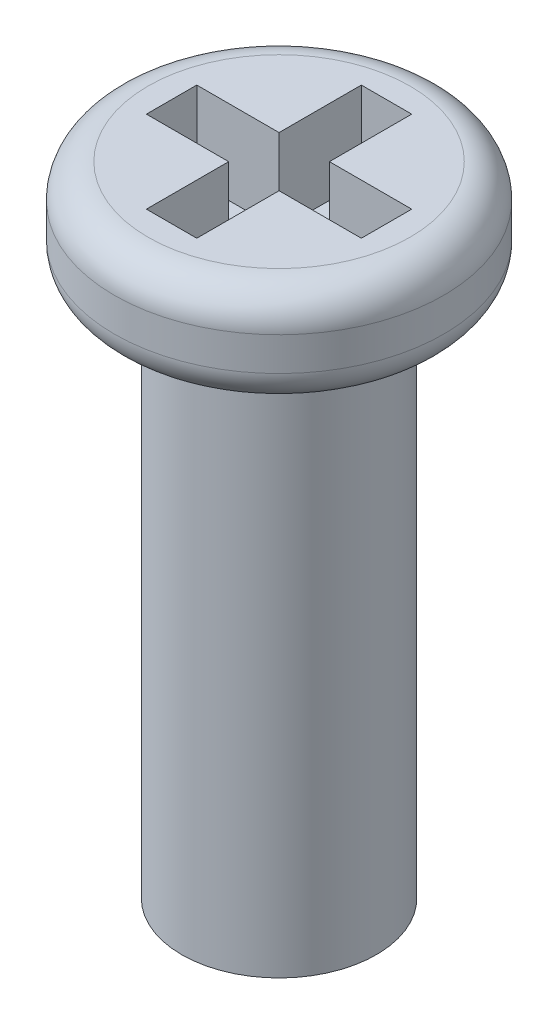
ISO-10303-21;
HEADER;
FILE_DESCRIPTION(('STEP AP214'),'2;1');
FILE_NAME('part.step','',(''),(''),'','','');
FILE_SCHEMA(('AUTOMOTIVE_DESIGN { 1 0 10303 214 1 1 1 1 }'));
ENDSEC;
DATA;
#1=APPLICATION_CONTEXT('core data for automotive mechanical design processes');
#2=APPLICATION_PROTOCOL_DEFINITION('international standard','automotive_design',2000,#1);
#3=PRODUCT_CONTEXT('',#1,'mechanical');
#4=PRODUCT('Part','Part','',(#3));
#5=PRODUCT_RELATED_PRODUCT_CATEGORY('part','',(#4));
#6=PRODUCT_DEFINITION_FORMATION('','',#4);
#7=PRODUCT_DEFINITION_CONTEXT('part definition',#1,'design');
#8=PRODUCT_DEFINITION('design','',#6,#7);
#9=PRODUCT_DEFINITION_SHAPE('','',#8);
#10=(LENGTH_UNIT() NAMED_UNIT(*) SI_UNIT(.MILLI.,.METRE.));
#11=(NAMED_UNIT(*) PLANE_ANGLE_UNIT() SI_UNIT($,.RADIAN.));
#12=(NAMED_UNIT(*) SI_UNIT($,.STERADIAN.) SOLID_ANGLE_UNIT());
#13=UNCERTAINTY_MEASURE_WITH_UNIT(LENGTH_MEASURE(1.E-05),#10,'distance_accuracy_value','');
#14=(GEOMETRIC_REPRESENTATION_CONTEXT(3) GLOBAL_UNCERTAINTY_ASSIGNED_CONTEXT((#13)) GLOBAL_UNIT_ASSIGNED_CONTEXT((#10,
#11,#12)) REPRESENTATION_CONTEXT('',''));
#15=CARTESIAN_POINT('',(0.,0.,0.));
#16=DIRECTION('',(0.,0.,1.));
#17=DIRECTION('',(1.,0.,0.));
#18=AXIS2_PLACEMENT_3D('',#15,#16,#17);
#19=CARTESIAN_POINT('',(0.,8.,0.));
#20=DIRECTION('',(0.,-1.,0.));
#21=DIRECTION('',(0.,0.,-1.));
#22=AXIS2_PLACEMENT_3D('',#19,#20,#21);
#23=CYLINDRICAL_SURFACE('',#22,1.45);
#24=CARTESIAN_POINT('',(0.,8.,0.));
#25=DIRECTION('',(0.,1.,0.));
#26=DIRECTION('',(0.,0.,1.));
#27=AXIS2_PLACEMENT_3D('',#24,#25,#26);
#28=CIRCLE('',#27,1.45);
#29=CARTESIAN_POINT('',(0.,8.,1.45));
#30=VERTEX_POINT('',#29);
#31=EDGE_CURVE('E178',#30,#30,#28,.T.);
#32=ORIENTED_EDGE('',*,*,#31,.F.);
#33=EDGE_LOOP('',(#32));
#34=FACE_BOUND('',#33,.T.);
#35=CARTESIAN_POINT('',(0.,0.,0.));
#36=DIRECTION('',(0.,1.,0.));
#37=DIRECTION('',(0.,0.,1.));
#38=AXIS2_PLACEMENT_3D('',#35,#36,#37);
#39=CIRCLE('',#38,1.45);
#40=CARTESIAN_POINT('',(0.,0.,1.45));
#41=VERTEX_POINT('',#40);
#42=EDGE_CURVE('E182',#41,#41,#39,.T.);
#43=ORIENTED_EDGE('',*,*,#42,.T.);
#44=EDGE_LOOP('',(#43));
#45=FACE_BOUND('',#44,.T.);
#46=ADVANCED_FACE('F32',(#34,#45),#23,.T.);
#47=CARTESIAN_POINT('',(0.,0.,0.));
#48=DIRECTION('',(0.,1.,0.));
#49=DIRECTION('',(0.,0.,1.));
#50=AXIS2_PLACEMENT_3D('',#47,#48,#49);
#51=PLANE('',#50);
#52=ORIENTED_EDGE('',*,*,#42,.F.);
#53=EDGE_LOOP('',(#52));
#54=FACE_BOUND('',#53,.T.);
#55=ADVANCED_FACE('F350',(#54),#51,.F.);
#56=CARTESIAN_POINT('',(0.,8.,0.));
#57=DIRECTION('',(0.,1.,0.));
#58=DIRECTION('',(0.,0.,1.));
#59=AXIS2_PLACEMENT_3D('',#56,#57,#58);
#60=PLANE('',#59);
#61=CARTESIAN_POINT('',(0.,8.,0.));
#62=DIRECTION('',(0.,1.,0.));
#63=DIRECTION('',(0.,0.,1.));
#64=AXIS2_PLACEMENT_3D('',#61,#62,#63);
#65=CIRCLE('',#64,1.95);
#66=CARTESIAN_POINT('',(0.,8.,1.95));
#67=VERTEX_POINT('',#66);
#68=EDGE_CURVE('E191',#67,#67,#65,.F.);
#69=ORIENTED_EDGE('',*,*,#68,.T.);
#70=EDGE_LOOP('',(#69));
#71=FACE_BOUND('',#70,.T.);
#72=ORIENTED_EDGE('',*,*,#31,.T.);
#73=EDGE_LOOP('',(#72));
#74=FACE_BOUND('',#73,.T.);
#75=ADVANCED_FACE('F356',(#71,#74),#60,.F.);
#76=CARTESIAN_POINT('',(0.,9.5,0.));
#77=DIRECTION('',(0.,-1.,0.));
#78=DIRECTION('',(0.,0.,-1.));
#79=AXIS2_PLACEMENT_3D('',#76,#77,#78);
#80=CYLINDRICAL_SURFACE('',#79,2.45);
#81=CARTESIAN_POINT('',(0.,8.5,0.));
#82=DIRECTION('',(0.,1.,0.));
#83=DIRECTION('',(0.,0.,1.));
#84=AXIS2_PLACEMENT_3D('',#81,#82,#83);
#85=CIRCLE('',#84,2.45);
#86=CARTESIAN_POINT('',(0.,8.5,2.45));
#87=VERTEX_POINT('',#86);
#88=EDGE_CURVE('E188',#87,#87,#85,.T.);
#89=ORIENTED_EDGE('',*,*,#88,.T.);
#90=EDGE_LOOP('',(#89));
#91=FACE_BOUND('',#90,.T.);
#92=CARTESIAN_POINT('',(0.,9.,0.));
#93=DIRECTION('',(0.,1.,0.));
#94=DIRECTION('',(0.,0.,1.));
#95=AXIS2_PLACEMENT_3D('',#92,#93,#94);
#96=CIRCLE('',#95,2.45);
#97=CARTESIAN_POINT('',(0.,9.,2.45));
#98=VERTEX_POINT('',#97);
#99=EDGE_CURVE('E181',#98,#98,#96,.F.);
#100=ORIENTED_EDGE('',*,*,#99,.T.);
#101=EDGE_LOOP('',(#100));
#102=FACE_BOUND('',#101,.T.);
#103=ADVANCED_FACE('F506',(#91,#102),#80,.T.);
#104=CARTESIAN_POINT('',(0.,9.5,0.));
#105=DIRECTION('',(0.,1.,0.));
#106=DIRECTION('',(0.,0.,1.));
#107=AXIS2_PLACEMENT_3D('',#104,#105,#106);
#108=PLANE('',#107);
#109=DIRECTION('',(0.,0.,1.));
#110=VECTOR('',#109,1.);
#111=CARTESIAN_POINT('',(-0.375,9.5,0.));
#112=LINE('',#111,#110);
#113=CARTESIAN_POINT('',(-0.375,9.5,-1.6));
#114=VERTEX_POINT('',#113);
#115=CARTESIAN_POINT('',(-0.375,9.5,-0.375));
#116=VERTEX_POINT('',#115);
#117=EDGE_CURVE('E168',#114,#116,#112,.T.);
#118=ORIENTED_EDGE('',*,*,#117,.F.);
#119=DIRECTION('',(1.,0.,0.));
#120=VECTOR('',#119,1.);
#121=CARTESIAN_POINT('',(0.,9.5,-1.6));
#122=LINE('',#121,#120);
#123=CARTESIAN_POINT('',(0.375,9.5,-1.6));
#124=VERTEX_POINT('',#123);
#125=EDGE_CURVE('E164',#114,#124,#122,.T.);
#126=ORIENTED_EDGE('',*,*,#125,.T.);
#127=DIRECTION('',(0.,0.,1.));
#128=VECTOR('',#127,1.);
#129=CARTESIAN_POINT('',(0.375,9.5,0.));
#130=LINE('',#129,#128);
#131=CARTESIAN_POINT('',(0.375,9.5,-0.375));
#132=VERTEX_POINT('',#131);
#133=EDGE_CURVE('E295',#124,#132,#130,.T.);
#134=ORIENTED_EDGE('',*,*,#133,.T.);
#135=DIRECTION('',(1.,0.,0.));
#136=VECTOR('',#135,1.);
#137=CARTESIAN_POINT('',(0.,9.5,-0.375));
#138=LINE('',#137,#136);
#139=CARTESIAN_POINT('',(1.6,9.5,-0.375));
#140=VERTEX_POINT('',#139);
#141=EDGE_CURVE('E293',#132,#140,#138,.T.);
#142=ORIENTED_EDGE('',*,*,#141,.T.);
#143=DIRECTION('',(0.,0.,1.));
#144=VECTOR('',#143,1.);
#145=CARTESIAN_POINT('',(1.6,9.5,0.));
#146=LINE('',#145,#144);
#147=CARTESIAN_POINT('',(1.6,9.5,0.375));
#148=VERTEX_POINT('',#147);
#149=EDGE_CURVE('E290',#140,#148,#146,.T.);
#150=ORIENTED_EDGE('',*,*,#149,.T.);
#151=DIRECTION('',(1.,0.,0.));
#152=VECTOR('',#151,1.);
#153=CARTESIAN_POINT('',(0.,9.5,0.375));
#154=LINE('',#153,#152);
#155=CARTESIAN_POINT('',(0.375,9.5,0.375));
#156=VERTEX_POINT('',#155);
#157=EDGE_CURVE('E287',#156,#148,#154,.T.);
#158=ORIENTED_EDGE('',*,*,#157,.F.);
#159=DIRECTION('',(0.,0.,1.));
#160=VECTOR('',#159,1.);
#161=CARTESIAN_POINT('',(0.375,9.5,0.));
#162=LINE('',#161,#160);
#163=CARTESIAN_POINT('',(0.375,9.5,1.6));
#164=VERTEX_POINT('',#163);
#165=EDGE_CURVE('E284',#156,#164,#162,.T.);
#166=ORIENTED_EDGE('',*,*,#165,.T.);
#167=DIRECTION('',(1.,0.,0.));
#168=VECTOR('',#167,1.);
#169=CARTESIAN_POINT('',(0.,9.5,1.6));
#170=LINE('',#169,#168);
#171=CARTESIAN_POINT('',(-0.375,9.5,1.6));
#172=VERTEX_POINT('',#171);
#173=EDGE_CURVE('E278',#172,#164,#170,.T.);
#174=ORIENTED_EDGE('',*,*,#173,.F.);
#175=DIRECTION('',(0.,0.,1.));
#176=VECTOR('',#175,1.);
#177=CARTESIAN_POINT('',(-0.375,9.5,0.));
#178=LINE('',#177,#176);
#179=CARTESIAN_POINT('',(-0.375,9.5,0.375));
#180=VERTEX_POINT('',#179);
#181=EDGE_CURVE('E276',#180,#172,#178,.T.);
#182=ORIENTED_EDGE('',*,*,#181,.F.);
#183=DIRECTION('',(1.,0.,0.));
#184=VECTOR('',#183,1.);
#185=CARTESIAN_POINT('',(0.,9.5,0.375));
#186=LINE('',#185,#184);
#187=CARTESIAN_POINT('',(-1.6,9.5,0.375));
#188=VERTEX_POINT('',#187);
#189=EDGE_CURVE('E262',#188,#180,#186,.T.);
#190=ORIENTED_EDGE('',*,*,#189,.F.);
#191=DIRECTION('',(0.,0.,1.));
#192=VECTOR('',#191,1.);
#193=CARTESIAN_POINT('',(-1.6,9.5,0.));
#194=LINE('',#193,#192);
#195=CARTESIAN_POINT('',(-1.6,9.5,-0.375));
#196=VERTEX_POINT('',#195);
#197=EDGE_CURVE('E267',#196,#188,#194,.T.);
#198=ORIENTED_EDGE('',*,*,#197,.F.);
#199=DIRECTION('',(1.,0.,0.));
#200=VECTOR('',#199,1.);
#201=CARTESIAN_POINT('',(0.,9.5,-0.375));
#202=LINE('',#201,#200);
#203=EDGE_CURVE('E270',#196,#116,#202,.T.);
#204=ORIENTED_EDGE('',*,*,#203,.T.);
#205=EDGE_LOOP('',(#118,#126,#134,#142,#150,#158,#166,#174,#182,#190,#198,#204));
#206=FACE_BOUND('',#205,.T.);
#207=CARTESIAN_POINT('',(0.,9.5,0.));
#208=DIRECTION('',(0.,1.,0.));
#209=DIRECTION('',(0.,0.,1.));
#210=AXIS2_PLACEMENT_3D('',#207,#208,#209);
#211=CIRCLE('',#210,1.95);
#212=CARTESIAN_POINT('',(0.,9.5,1.95));
#213=VERTEX_POINT('',#212);
#214=EDGE_CURVE('E194',#213,#213,#211,.T.);
#215=ORIENTED_EDGE('',*,*,#214,.T.);
#216=EDGE_LOOP('',(#215));
#217=FACE_BOUND('',#216,.T.);
#218=ADVANCED_FACE('F272',(#206,#217),#108,.T.);
#219=CARTESIAN_POINT('',(0.,8.5,0.));
#220=DIRECTION('',(0.,1.,0.));
#221=DIRECTION('',(0.,0.,1.));
#222=AXIS2_PLACEMENT_3D('',#219,#220,#221);
#223=TOROIDAL_SURFACE('',#222,1.95,0.5);
#224=ORIENTED_EDGE('',*,*,#68,.F.);
#225=EDGE_LOOP('',(#224));
#226=FACE_BOUND('',#225,.T.);
#227=ORIENTED_EDGE('',*,*,#88,.F.);
#228=EDGE_LOOP('',(#227));
#229=FACE_BOUND('',#228,.T.);
#230=ADVANCED_FACE('F363',(#226,#229),#223,.T.);
#231=CARTESIAN_POINT('',(0.,9.,0.));
#232=DIRECTION('',(0.,1.,0.));
#233=DIRECTION('',(0.,0.,1.));
#234=AXIS2_PLACEMENT_3D('',#231,#232,#233);
#235=TOROIDAL_SURFACE('',#234,1.95,0.5);
#236=ORIENTED_EDGE('',*,*,#99,.F.);
#237=EDGE_LOOP('',(#236));
#238=FACE_BOUND('',#237,.T.);
#239=ORIENTED_EDGE('',*,*,#214,.F.);
#240=EDGE_LOOP('',(#239));
#241=FACE_BOUND('',#240,.T.);
#242=ADVANCED_FACE('F366',(#238,#241),#235,.T.);
#243=CARTESIAN_POINT('',(-0.375,8.25,0.));
#244=DIRECTION('',(-1.,0.,0.));
#245=DIRECTION('',(0.,0.,1.));
#246=AXIS2_PLACEMENT_3D('',#243,#244,#245);
#247=PLANE('',#246);
#248=DIRECTION('',(0.,0.,1.));
#249=VECTOR('',#248,1.);
#250=CARTESIAN_POINT('',(-0.375,8.25,0.));
#251=LINE('',#250,#249);
#252=CARTESIAN_POINT('',(-0.375,8.25,-1.1));
#253=VERTEX_POINT('',#252);
#254=CARTESIAN_POINT('',(-0.375,8.25,-0.375));
#255=VERTEX_POINT('',#254);
#256=EDGE_CURVE('E158',#253,#255,#251,.T.);
#257=ORIENTED_EDGE('',*,*,#256,.F.);
#258=CARTESIAN_POINT('',(-0.375,8.75,-1.1));
#259=DIRECTION('',(-1.,0.,0.));
#260=DIRECTION('',(0.,0.,1.));
#261=AXIS2_PLACEMENT_3D('',#258,#259,#260);
#262=CIRCLE('',#261,0.5);
#263=CARTESIAN_POINT('',(-0.375,8.75,-1.6));
#264=VERTEX_POINT('',#263);
#265=EDGE_CURVE('E11',#253,#264,#262,.F.);
#266=ORIENTED_EDGE('',*,*,#265,.T.);
#267=DIRECTION('',(0.,1.,0.));
#268=VECTOR('',#267,1.);
#269=CARTESIAN_POINT('',(-0.375,8.25,-1.6));
#270=LINE('',#269,#268);
#271=EDGE_CURVE('E185',#264,#114,#270,.T.);
#272=ORIENTED_EDGE('',*,*,#271,.T.);
#273=ORIENTED_EDGE('',*,*,#117,.T.);
#274=DIRECTION('',(0.,1.,0.));
#275=VECTOR('',#274,1.);
#276=CARTESIAN_POINT('',(-0.375,8.25,-0.375));
#277=LINE('',#276,#275);
#278=EDGE_CURVE('E150',#255,#116,#277,.T.);
#279=ORIENTED_EDGE('',*,*,#278,.F.);
#280=EDGE_LOOP('',(#257,#266,#272,#273,#279));
#281=FACE_BOUND('',#280,.T.);
#282=ADVANCED_FACE('F166',(#281),#247,.F.);
#283=CARTESIAN_POINT('',(0.,8.25,-1.6));
#284=DIRECTION('',(0.,0.,1.));
#285=DIRECTION('',(1.,0.,0.));
#286=AXIS2_PLACEMENT_3D('',#283,#284,#285);
#287=PLANE('',#286);
#288=ORIENTED_EDGE('',*,*,#271,.F.);
#289=DIRECTION('',(1.,0.,0.));
#290=VECTOR('',#289,1.);
#291=CARTESIAN_POINT('',(0.375,8.75,-1.6));
#292=LINE('',#291,#290);
#293=CARTESIAN_POINT('',(0.375,8.75,-1.6));
#294=VERTEX_POINT('',#293);
#295=EDGE_CURVE('E223',#264,#294,#292,.T.);
#296=ORIENTED_EDGE('',*,*,#295,.T.);
#297=DIRECTION('',(0.,1.,0.));
#298=VECTOR('',#297,1.);
#299=CARTESIAN_POINT('',(0.375,8.25,-1.6));
#300=LINE('',#299,#298);
#301=EDGE_CURVE('E229',#294,#124,#300,.T.);
#302=ORIENTED_EDGE('',*,*,#301,.T.);
#303=ORIENTED_EDGE('',*,*,#125,.F.);
#304=EDGE_LOOP('',(#288,#296,#302,#303));
#305=FACE_BOUND('',#304,.T.);
#306=ADVANCED_FACE('F233',(#305),#287,.T.);
#307=CARTESIAN_POINT('',(0.375,8.25,0.));
#308=DIRECTION('',(-1.,0.,0.));
#309=DIRECTION('',(0.,0.,1.));
#310=AXIS2_PLACEMENT_3D('',#307,#308,#309);
#311=PLANE('',#310);
#312=ORIENTED_EDGE('',*,*,#301,.F.);
#313=CARTESIAN_POINT('',(0.375,8.75,-1.1));
#314=DIRECTION('',(-1.,0.,0.));
#315=DIRECTION('',(0.,0.,1.));
#316=AXIS2_PLACEMENT_3D('',#313,#314,#315);
#317=CIRCLE('',#316,0.5);
#318=CARTESIAN_POINT('',(0.375,8.25,-1.1));
#319=VERTEX_POINT('',#318);
#320=EDGE_CURVE('E40',#294,#319,#317,.T.);
#321=ORIENTED_EDGE('',*,*,#320,.T.);
#322=DIRECTION('',(0.,0.,1.));
#323=VECTOR('',#322,1.);
#324=CARTESIAN_POINT('',(0.375,8.25,0.));
#325=LINE('',#324,#323);
#326=CARTESIAN_POINT('',(0.375,8.25,-0.375));
#327=VERTEX_POINT('',#326);
#328=EDGE_CURVE('E170',#319,#327,#325,.T.);
#329=ORIENTED_EDGE('',*,*,#328,.T.);
#330=DIRECTION('',(0.,1.,0.));
#331=VECTOR('',#330,1.);
#332=CARTESIAN_POINT('',(0.375,8.25,-0.375));
#333=LINE('',#332,#331);
#334=EDGE_CURVE('E237',#327,#132,#333,.T.);
#335=ORIENTED_EDGE('',*,*,#334,.T.);
#336=ORIENTED_EDGE('',*,*,#133,.F.);
#337=EDGE_LOOP('',(#312,#321,#329,#335,#336));
#338=FACE_BOUND('',#337,.T.);
#339=ADVANCED_FACE('F226',(#338),#311,.T.);
#340=CARTESIAN_POINT('',(0.,8.25,-0.375));
#341=DIRECTION('',(0.,0.,1.));
#342=DIRECTION('',(1.,0.,0.));
#343=AXIS2_PLACEMENT_3D('',#340,#341,#342);
#344=PLANE('',#343);
#345=DIRECTION('',(1.,0.,0.));
#346=VECTOR('',#345,1.);
#347=CARTESIAN_POINT('',(0.,8.25,-0.375));
#348=LINE('',#347,#346);
#349=CARTESIAN_POINT('',(1.1,8.25,-0.375));
#350=VERTEX_POINT('',#349);
#351=EDGE_CURVE('E174',#327,#350,#348,.T.);
#352=ORIENTED_EDGE('',*,*,#351,.T.);
#353=CARTESIAN_POINT('',(1.1,8.75,-0.375));
#354=DIRECTION('',(0.,0.,1.));
#355=DIRECTION('',(1.,0.,0.));
#356=AXIS2_PLACEMENT_3D('',#353,#354,#355);
#357=CIRCLE('',#356,0.5);
#358=CARTESIAN_POINT('',(1.6,8.75,-0.375));
#359=VERTEX_POINT('',#358);
#360=EDGE_CURVE('E216',#350,#359,#357,.T.);
#361=ORIENTED_EDGE('',*,*,#360,.T.);
#362=DIRECTION('',(0.,1.,0.));
#363=VECTOR('',#362,1.);
#364=CARTESIAN_POINT('',(1.6,8.25,-0.375));
#365=LINE('',#364,#363);
#366=EDGE_CURVE('E243',#359,#140,#365,.T.);
#367=ORIENTED_EDGE('',*,*,#366,.T.);
#368=ORIENTED_EDGE('',*,*,#141,.F.);
#369=ORIENTED_EDGE('',*,*,#334,.F.);
#370=EDGE_LOOP('',(#352,#361,#367,#368,#369));
#371=FACE_BOUND('',#370,.T.);
#372=ADVANCED_FACE('F334',(#371),#344,.T.);
#373=CARTESIAN_POINT('',(1.6,8.25,0.));
#374=DIRECTION('',(-1.,0.,0.));
#375=DIRECTION('',(0.,0.,1.));
#376=AXIS2_PLACEMENT_3D('',#373,#374,#375);
#377=PLANE('',#376);
#378=ORIENTED_EDGE('',*,*,#366,.F.);
#379=DIRECTION('',(0.,0.,1.));
#380=VECTOR('',#379,1.);
#381=CARTESIAN_POINT('',(1.6,8.75,0.375));
#382=LINE('',#381,#380);
#383=CARTESIAN_POINT('',(1.6,8.75,0.375));
#384=VERTEX_POINT('',#383);
#385=EDGE_CURVE('E211',#359,#384,#382,.T.);
#386=ORIENTED_EDGE('',*,*,#385,.T.);
#387=DIRECTION('',(0.,1.,0.));
#388=VECTOR('',#387,1.);
#389=CARTESIAN_POINT('',(1.6,8.25,0.375));
#390=LINE('',#389,#388);
#391=EDGE_CURVE('E245',#384,#148,#390,.T.);
#392=ORIENTED_EDGE('',*,*,#391,.T.);
#393=ORIENTED_EDGE('',*,*,#149,.F.);
#394=EDGE_LOOP('',(#378,#386,#392,#393));
#395=FACE_BOUND('',#394,.T.);
#396=ADVANCED_FACE('F338',(#395),#377,.T.);
#397=CARTESIAN_POINT('',(0.,8.25,0.375));
#398=DIRECTION('',(0.,0.,1.));
#399=DIRECTION('',(1.,0.,0.));
#400=AXIS2_PLACEMENT_3D('',#397,#398,#399);
#401=PLANE('',#400);
#402=ORIENTED_EDGE('',*,*,#391,.F.);
#403=CARTESIAN_POINT('',(1.1,8.75,0.375));
#404=DIRECTION('',(0.,0.,1.));
#405=DIRECTION('',(1.,0.,0.));
#406=AXIS2_PLACEMENT_3D('',#403,#404,#405);
#407=CIRCLE('',#406,0.5);
#408=CARTESIAN_POINT('',(1.1,8.25,0.375));
#409=VERTEX_POINT('',#408);
#410=EDGE_CURVE('E214',#384,#409,#407,.F.);
#411=ORIENTED_EDGE('',*,*,#410,.T.);
#412=DIRECTION('',(1.,0.,0.));
#413=VECTOR('',#412,1.);
#414=CARTESIAN_POINT('',(0.,8.25,0.375));
#415=LINE('',#414,#413);
#416=CARTESIAN_POINT('',(0.375,8.25,0.375));
#417=VERTEX_POINT('',#416);
#418=EDGE_CURVE('E300',#417,#409,#415,.T.);
#419=ORIENTED_EDGE('',*,*,#418,.F.);
#420=DIRECTION('',(0.,1.,0.));
#421=VECTOR('',#420,1.);
#422=CARTESIAN_POINT('',(0.375,8.25,0.375));
#423=LINE('',#422,#421);
#424=EDGE_CURVE('E247',#417,#156,#423,.T.);
#425=ORIENTED_EDGE('',*,*,#424,.T.);
#426=ORIENTED_EDGE('',*,*,#157,.T.);
#427=EDGE_LOOP('',(#402,#411,#419,#425,#426));
#428=FACE_BOUND('',#427,.T.);
#429=ADVANCED_FACE('F326',(#428),#401,.F.);
#430=CARTESIAN_POINT('',(0.375,8.25,0.));
#431=DIRECTION('',(-1.,0.,0.));
#432=DIRECTION('',(0.,0.,1.));
#433=AXIS2_PLACEMENT_3D('',#430,#431,#432);
#434=PLANE('',#433);
#435=DIRECTION('',(0.,0.,1.));
#436=VECTOR('',#435,1.);
#437=CARTESIAN_POINT('',(0.375,8.25,0.));
#438=LINE('',#437,#436);
#439=CARTESIAN_POINT('',(0.375,8.25,1.1));
#440=VERTEX_POINT('',#439);
#441=EDGE_CURVE('E303',#417,#440,#438,.T.);
#442=ORIENTED_EDGE('',*,*,#441,.T.);
#443=CARTESIAN_POINT('',(0.375,8.75,1.1));
#444=DIRECTION('',(-1.,0.,0.));
#445=DIRECTION('',(0.,0.,1.));
#446=AXIS2_PLACEMENT_3D('',#443,#444,#445);
#447=CIRCLE('',#446,0.5);
#448=CARTESIAN_POINT('',(0.375,8.75,1.6));
#449=VERTEX_POINT('',#448);
#450=EDGE_CURVE('E205',#440,#449,#447,.T.);
#451=ORIENTED_EDGE('',*,*,#450,.T.);
#452=DIRECTION('',(0.,1.,0.));
#453=VECTOR('',#452,1.);
#454=CARTESIAN_POINT('',(0.375,8.25,1.6));
#455=LINE('',#454,#453);
#456=EDGE_CURVE('E249',#449,#164,#455,.T.);
#457=ORIENTED_EDGE('',*,*,#456,.T.);
#458=ORIENTED_EDGE('',*,*,#165,.F.);
#459=ORIENTED_EDGE('',*,*,#424,.F.);
#460=EDGE_LOOP('',(#442,#451,#457,#458,#459));
#461=FACE_BOUND('',#460,.T.);
#462=ADVANCED_FACE('F320',(#461),#434,.T.);
#463=CARTESIAN_POINT('',(0.,8.25,1.6));
#464=DIRECTION('',(0.,0.,1.));
#465=DIRECTION('',(1.,0.,0.));
#466=AXIS2_PLACEMENT_3D('',#463,#464,#465);
#467=PLANE('',#466);
#468=ORIENTED_EDGE('',*,*,#456,.F.);
#469=DIRECTION('',(1.,0.,0.));
#470=VECTOR('',#469,1.);
#471=CARTESIAN_POINT('',(0.,8.75,1.6));
#472=LINE('',#471,#470);
#473=CARTESIAN_POINT('',(-0.375,8.75,1.6));
#474=VERTEX_POINT('',#473);
#475=EDGE_CURVE('E207',#449,#474,#472,.F.);
#476=ORIENTED_EDGE('',*,*,#475,.T.);
#477=DIRECTION('',(0.,1.,0.));
#478=VECTOR('',#477,1.);
#479=CARTESIAN_POINT('',(-0.375,8.25,1.6));
#480=LINE('',#479,#478);
#481=EDGE_CURVE('E251',#474,#172,#480,.T.);
#482=ORIENTED_EDGE('',*,*,#481,.T.);
#483=ORIENTED_EDGE('',*,*,#173,.T.);
#484=EDGE_LOOP('',(#468,#476,#482,#483));
#485=FACE_BOUND('',#484,.T.);
#486=ADVANCED_FACE('F340',(#485),#467,.F.);
#487=CARTESIAN_POINT('',(-0.375,8.25,0.));
#488=DIRECTION('',(-1.,0.,0.));
#489=DIRECTION('',(0.,0.,1.));
#490=AXIS2_PLACEMENT_3D('',#487,#488,#489);
#491=PLANE('',#490);
#492=ORIENTED_EDGE('',*,*,#481,.F.);
#493=CARTESIAN_POINT('',(-0.375,8.75,1.1));
#494=DIRECTION('',(-1.,0.,0.));
#495=DIRECTION('',(0.,0.,1.));
#496=AXIS2_PLACEMENT_3D('',#493,#494,#495);
#497=CIRCLE('',#496,0.5);
#498=CARTESIAN_POINT('',(-0.375,8.25,1.1));
#499=VERTEX_POINT('',#498);
#500=EDGE_CURVE('E209',#474,#499,#497,.F.);
#501=ORIENTED_EDGE('',*,*,#500,.T.);
#502=DIRECTION('',(0.,0.,1.));
#503=VECTOR('',#502,1.);
#504=CARTESIAN_POINT('',(-0.375,8.25,0.));
#505=LINE('',#504,#503);
#506=CARTESIAN_POINT('',(-0.375,8.25,0.375));
#507=VERTEX_POINT('',#506);
#508=EDGE_CURVE('E306',#507,#499,#505,.T.);
#509=ORIENTED_EDGE('',*,*,#508,.F.);
#510=DIRECTION('',(0.,1.,0.));
#511=VECTOR('',#510,1.);
#512=CARTESIAN_POINT('',(-0.375,8.25,0.375));
#513=LINE('',#512,#511);
#514=EDGE_CURVE('E253',#507,#180,#513,.T.);
#515=ORIENTED_EDGE('',*,*,#514,.T.);
#516=ORIENTED_EDGE('',*,*,#181,.T.);
#517=EDGE_LOOP('',(#492,#501,#509,#515,#516));
#518=FACE_BOUND('',#517,.T.);
#519=ADVANCED_FACE('F312',(#518),#491,.F.);
#520=CARTESIAN_POINT('',(0.,8.25,0.375));
#521=DIRECTION('',(0.,0.,1.));
#522=DIRECTION('',(1.,0.,0.));
#523=AXIS2_PLACEMENT_3D('',#520,#521,#522);
#524=PLANE('',#523);
#525=DIRECTION('',(1.,0.,0.));
#526=VECTOR('',#525,1.);
#527=CARTESIAN_POINT('',(0.,8.25,0.375));
#528=LINE('',#527,#526);
#529=CARTESIAN_POINT('',(-1.1,8.25,0.375));
#530=VERTEX_POINT('',#529);
#531=EDGE_CURVE('E157',#530,#507,#528,.T.);
#532=ORIENTED_EDGE('',*,*,#531,.F.);
#533=CARTESIAN_POINT('',(-1.1,8.75,0.375));
#534=DIRECTION('',(0.,0.,1.));
#535=DIRECTION('',(1.,0.,0.));
#536=AXIS2_PLACEMENT_3D('',#533,#534,#535);
#537=CIRCLE('',#536,0.5);
#538=CARTESIAN_POINT('',(-1.6,8.75,0.375));
#539=VERTEX_POINT('',#538);
#540=EDGE_CURVE('E218',#530,#539,#537,.F.);
#541=ORIENTED_EDGE('',*,*,#540,.T.);
#542=DIRECTION('',(0.,1.,0.));
#543=VECTOR('',#542,1.);
#544=CARTESIAN_POINT('',(-1.6,8.25,0.375));
#545=LINE('',#544,#543);
#546=EDGE_CURVE('E172',#539,#188,#545,.T.);
#547=ORIENTED_EDGE('',*,*,#546,.T.);
#548=ORIENTED_EDGE('',*,*,#189,.T.);
#549=ORIENTED_EDGE('',*,*,#514,.F.);
#550=EDGE_LOOP('',(#532,#541,#547,#548,#549));
#551=FACE_BOUND('',#550,.T.);
#552=ADVANCED_FACE('F259',(#551),#524,.F.);
#553=CARTESIAN_POINT('',(-1.6,8.25,0.));
#554=DIRECTION('',(-1.,0.,0.));
#555=DIRECTION('',(0.,0.,1.));
#556=AXIS2_PLACEMENT_3D('',#553,#554,#555);
#557=PLANE('',#556);
#558=ORIENTED_EDGE('',*,*,#546,.F.);
#559=DIRECTION('',(0.,0.,1.));
#560=VECTOR('',#559,1.);
#561=CARTESIAN_POINT('',(-1.6,8.75,0.));
#562=LINE('',#561,#560);
#563=CARTESIAN_POINT('',(-1.6,8.75,-0.375));
#564=VERTEX_POINT('',#563);
#565=EDGE_CURVE('E220',#539,#564,#562,.F.);
#566=ORIENTED_EDGE('',*,*,#565,.T.);
#567=DIRECTION('',(0.,1.,0.));
#568=VECTOR('',#567,1.);
#569=CARTESIAN_POINT('',(-1.6,8.25,-0.375));
#570=LINE('',#569,#568);
#571=EDGE_CURVE('E169',#564,#196,#570,.T.);
#572=ORIENTED_EDGE('',*,*,#571,.T.);
#573=ORIENTED_EDGE('',*,*,#197,.T.);
#574=EDGE_LOOP('',(#558,#566,#572,#573));
#575=FACE_BOUND('',#574,.T.);
#576=ADVANCED_FACE('F268',(#575),#557,.F.);
#577=CARTESIAN_POINT('',(0.,8.25,-0.375));
#578=DIRECTION('',(0.,0.,1.));
#579=DIRECTION('',(1.,0.,0.));
#580=AXIS2_PLACEMENT_3D('',#577,#578,#579);
#581=PLANE('',#580);
#582=ORIENTED_EDGE('',*,*,#571,.F.);
#583=CARTESIAN_POINT('',(-1.1,8.75,-0.375));
#584=DIRECTION('',(0.,0.,1.));
#585=DIRECTION('',(1.,0.,0.));
#586=AXIS2_PLACEMENT_3D('',#583,#584,#585);
#587=CIRCLE('',#586,0.5);
#588=CARTESIAN_POINT('',(-1.1,8.25,-0.375));
#589=VERTEX_POINT('',#588);
#590=EDGE_CURVE('E153',#564,#589,#587,.T.);
#591=ORIENTED_EDGE('',*,*,#590,.T.);
#592=DIRECTION('',(1.,0.,0.));
#593=VECTOR('',#592,1.);
#594=CARTESIAN_POINT('',(0.,8.25,-0.375));
#595=LINE('',#594,#593);
#596=EDGE_CURVE('E144',#589,#255,#595,.T.);
#597=ORIENTED_EDGE('',*,*,#596,.T.);
#598=ORIENTED_EDGE('',*,*,#278,.T.);
#599=ORIENTED_EDGE('',*,*,#203,.F.);
#600=EDGE_LOOP('',(#582,#591,#597,#598,#599));
#601=FACE_BOUND('',#600,.T.);
#602=ADVANCED_FACE('F147',(#601),#581,.T.);
#603=CARTESIAN_POINT('',(0.,8.25,0.));
#604=DIRECTION('',(0.,1.,0.));
#605=DIRECTION('',(0.,0.,1.));
#606=AXIS2_PLACEMENT_3D('',#603,#604,#605);
#607=PLANE('',#606);
#608=ORIENTED_EDGE('',*,*,#508,.T.);
#609=DIRECTION('',(1.,0.,0.));
#610=VECTOR('',#609,1.);
#611=CARTESIAN_POINT('',(0.,8.25,1.1));
#612=LINE('',#611,#610);
#613=EDGE_CURVE('E202',#499,#440,#612,.T.);
#614=ORIENTED_EDGE('',*,*,#613,.T.);
#615=ORIENTED_EDGE('',*,*,#441,.F.);
#616=ORIENTED_EDGE('',*,*,#418,.T.);
#617=DIRECTION('',(0.,0.,1.));
#618=VECTOR('',#617,1.);
#619=CARTESIAN_POINT('',(1.1,8.25,-0.375));
#620=LINE('',#619,#618);
#621=EDGE_CURVE('E200',#409,#350,#620,.F.);
#622=ORIENTED_EDGE('',*,*,#621,.T.);
#623=ORIENTED_EDGE('',*,*,#351,.F.);
#624=ORIENTED_EDGE('',*,*,#328,.F.);
#625=DIRECTION('',(1.,0.,0.));
#626=VECTOR('',#625,1.);
#627=CARTESIAN_POINT('',(-0.375,8.25,-1.1));
#628=LINE('',#627,#626);
#629=EDGE_CURVE('E163',#319,#253,#628,.F.);
#630=ORIENTED_EDGE('',*,*,#629,.T.);
#631=ORIENTED_EDGE('',*,*,#256,.T.);
#632=ORIENTED_EDGE('',*,*,#596,.F.);
#633=DIRECTION('',(0.,0.,1.));
#634=VECTOR('',#633,1.);
#635=CARTESIAN_POINT('',(-1.1,8.25,0.));
#636=LINE('',#635,#634);
#637=EDGE_CURVE('E198',#589,#530,#636,.T.);
#638=ORIENTED_EDGE('',*,*,#637,.T.);
#639=ORIENTED_EDGE('',*,*,#531,.T.);
#640=EDGE_LOOP('',(#608,#614,#615,#616,#622,#623,#624,#630,#631,#632,#638,#639));
#641=FACE_BOUND('',#640,.T.);
#642=ADVANCED_FACE('F161',(#641),#607,.T.);
#643=CARTESIAN_POINT('',(0.,8.75,1.1));
#644=DIRECTION('',(1.,0.,0.));
#645=DIRECTION('',(0.,0.,-1.));
#646=AXIS2_PLACEMENT_3D('',#643,#644,#645);
#647=CYLINDRICAL_SURFACE('',#646,0.5);
#648=ORIENTED_EDGE('',*,*,#500,.F.);
#649=ORIENTED_EDGE('',*,*,#475,.F.);
#650=ORIENTED_EDGE('',*,*,#450,.F.);
#651=ORIENTED_EDGE('',*,*,#613,.F.);
#652=EDGE_LOOP('',(#648,#649,#650,#651));
#653=FACE_BOUND('',#652,.T.);
#654=ADVANCED_FACE('F316',(#653),#647,.F.);
#655=CARTESIAN_POINT('',(1.1,8.75,0.));
#656=DIRECTION('',(0.,0.,-1.));
#657=DIRECTION('',(-1.,0.,0.));
#658=AXIS2_PLACEMENT_3D('',#655,#656,#657);
#659=CYLINDRICAL_SURFACE('',#658,0.5);
#660=ORIENTED_EDGE('',*,*,#360,.F.);
#661=ORIENTED_EDGE('',*,*,#621,.F.);
#662=ORIENTED_EDGE('',*,*,#410,.F.);
#663=ORIENTED_EDGE('',*,*,#385,.F.);
#664=EDGE_LOOP('',(#660,#661,#662,#663));
#665=FACE_BOUND('',#664,.T.);
#666=ADVANCED_FACE('F330',(#665),#659,.F.);
#667=CARTESIAN_POINT('',(-1.1,8.75,0.));
#668=DIRECTION('',(0.,0.,1.));
#669=DIRECTION('',(1.,0.,0.));
#670=AXIS2_PLACEMENT_3D('',#667,#668,#669);
#671=CYLINDRICAL_SURFACE('',#670,0.5);
#672=ORIENTED_EDGE('',*,*,#590,.F.);
#673=ORIENTED_EDGE('',*,*,#565,.F.);
#674=ORIENTED_EDGE('',*,*,#540,.F.);
#675=ORIENTED_EDGE('',*,*,#637,.F.);
#676=EDGE_LOOP('',(#672,#673,#674,#675));
#677=FACE_BOUND('',#676,.T.);
#678=ADVANCED_FACE('F374',(#677),#671,.F.);
#679=CARTESIAN_POINT('',(0.,8.75,-1.1));
#680=DIRECTION('',(-1.,0.,0.));
#681=DIRECTION('',(0.,0.,1.));
#682=AXIS2_PLACEMENT_3D('',#679,#680,#681);
#683=CYLINDRICAL_SURFACE('',#682,0.5);
#684=ORIENTED_EDGE('',*,*,#265,.F.);
#685=ORIENTED_EDGE('',*,*,#629,.F.);
#686=ORIENTED_EDGE('',*,*,#320,.F.);
#687=ORIENTED_EDGE('',*,*,#295,.F.);
#688=EDGE_LOOP('',(#684,#685,#686,#687));
#689=FACE_BOUND('',#688,.T.);
#690=ADVANCED_FACE('F34',(#689),#683,.F.);
#691=CLOSED_SHELL('',(#46,#55,#75,#103,#218,#230,#242,#282,#306,#339,#372,#396,#429,#462,#486,
#519,#552,#576,#602,#642,#654,#666,#678,#690));
#692=MANIFOLD_SOLID_BREP('B2',#691);
#693=ADVANCED_BREP_SHAPE_REPRESENTATION('',(#18,#692),#14);
#694=SHAPE_DEFINITION_REPRESENTATION(#9,#693);
ENDSEC;
END-ISO-10303-21;
